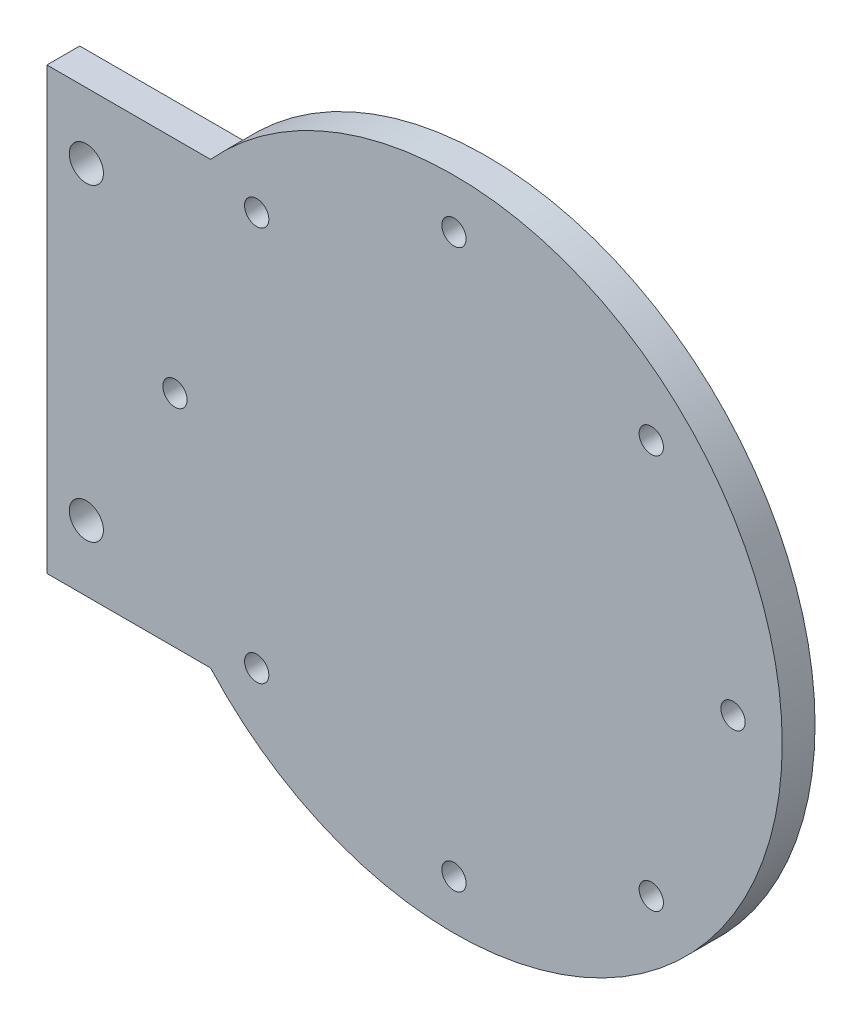
ISO-10303-21;
HEADER;
FILE_DESCRIPTION(('STEP AP214'),'2;1');
FILE_NAME('part.step','',(''),(''),'','','');
FILE_SCHEMA(('AUTOMOTIVE_DESIGN { 1 0 10303 214 1 1 1 1 }'));
ENDSEC;
DATA;
#1=APPLICATION_CONTEXT('core data for automotive mechanical design processes');
#2=APPLICATION_PROTOCOL_DEFINITION('international standard','automotive_design',2000,#1);
#3=PRODUCT_CONTEXT('',#1,'mechanical');
#4=PRODUCT('Part','Part','',(#3));
#5=PRODUCT_RELATED_PRODUCT_CATEGORY('part','',(#4));
#6=PRODUCT_DEFINITION_FORMATION('','',#4);
#7=PRODUCT_DEFINITION_CONTEXT('part definition',#1,'design');
#8=PRODUCT_DEFINITION('design','',#6,#7);
#9=PRODUCT_DEFINITION_SHAPE('','',#8);
#10=(LENGTH_UNIT() NAMED_UNIT(*) SI_UNIT(.MILLI.,.METRE.));
#11=(NAMED_UNIT(*) PLANE_ANGLE_UNIT() SI_UNIT($,.RADIAN.));
#12=(NAMED_UNIT(*) SI_UNIT($,.STERADIAN.) SOLID_ANGLE_UNIT());
#13=UNCERTAINTY_MEASURE_WITH_UNIT(LENGTH_MEASURE(1.E-05),#10,'distance_accuracy_value','');
#14=(GEOMETRIC_REPRESENTATION_CONTEXT(3) GLOBAL_UNCERTAINTY_ASSIGNED_CONTEXT((#13)) GLOBAL_UNIT_ASSIGNED_CONTEXT((#10,
#11,#12)) REPRESENTATION_CONTEXT('',''));
#15=CARTESIAN_POINT('',(0.,0.,0.));
#16=DIRECTION('',(0.,0.,1.));
#17=DIRECTION('',(1.,0.,0.));
#18=AXIS2_PLACEMENT_3D('',#15,#16,#17);
#19=CARTESIAN_POINT('',(0.,0.,-5.));
#20=DIRECTION('',(0.,0.,-1.));
#21=DIRECTION('',(1.,0.,0.));
#22=AXIS2_PLACEMENT_3D('',#19,#20,#21);
#23=PLANE('',#22);
#24=CARTESIAN_POINT('',(-36.3216750602466,-0.267487409630021,-5.));
#25=DIRECTION('',(0.,0.,1.));
#26=DIRECTION('',(1.,0.,0.));
#27=AXIS2_PLACEMENT_3D('',#24,#25,#26);
#28=CIRCLE('',#27,1.85);
#29=CARTESIAN_POINT('',(-34.4716750602466,-0.267487409630021,-5.));
#30=VERTEX_POINT('',#29);
#31=EDGE_CURVE('E130',#30,#30,#28,.T.);
#32=ORIENTED_EDGE('',*,*,#31,.T.);
#33=EDGE_LOOP('',(#32));
#34=FACE_BOUND('',#33,.T.);
#35=CARTESIAN_POINT('',(-23.8737132606749,-30.3195256100583,-5.));
#36=DIRECTION('',(0.,0.,1.));
#37=DIRECTION('',(1.,0.,0.));
#38=AXIS2_PLACEMENT_3D('',#35,#36,#37);
#39=CIRCLE('',#38,1.85);
#40=CARTESIAN_POINT('',(-22.0237132606749,-30.3195256100583,-5.));
#41=VERTEX_POINT('',#40);
#42=EDGE_CURVE('E135',#41,#41,#39,.T.);
#43=ORIENTED_EDGE('',*,*,#42,.T.);
#44=EDGE_LOOP('',(#43));
#45=FACE_BOUND('',#44,.T.);
#46=CARTESIAN_POINT('',(6.17832493975338,-42.76748740963,-5.));
#47=DIRECTION('',(0.,0.,1.));
#48=DIRECTION('',(1.,0.,0.));
#49=AXIS2_PLACEMENT_3D('',#46,#47,#48);
#50=CIRCLE('',#49,1.85);
#51=CARTESIAN_POINT('',(8.02832493975338,-42.76748740963,-5.));
#52=VERTEX_POINT('',#51);
#53=EDGE_CURVE('E138',#52,#52,#50,.T.);
#54=ORIENTED_EDGE('',*,*,#53,.T.);
#55=EDGE_LOOP('',(#54));
#56=FACE_BOUND('',#55,.T.);
#57=CARTESIAN_POINT('',(36.2303631401817,-30.3195256100583,-5.));
#58=DIRECTION('',(0.,0.,1.));
#59=DIRECTION('',(1.,0.,0.));
#60=AXIS2_PLACEMENT_3D('',#57,#58,#59);
#61=CIRCLE('',#60,1.85);
#62=CARTESIAN_POINT('',(38.0803631401817,-30.3195256100583,-5.));
#63=VERTEX_POINT('',#62);
#64=EDGE_CURVE('E141',#63,#63,#61,.T.);
#65=ORIENTED_EDGE('',*,*,#64,.T.);
#66=EDGE_LOOP('',(#65));
#67=FACE_BOUND('',#66,.T.);
#68=CARTESIAN_POINT('',(48.6783249397534,-0.267487409630026,-5.));
#69=DIRECTION('',(0.,0.,1.));
#70=DIRECTION('',(1.,0.,0.));
#71=AXIS2_PLACEMENT_3D('',#68,#69,#70);
#72=CIRCLE('',#71,1.85);
#73=CARTESIAN_POINT('',(50.5283249397534,-0.267487409630026,-5.));
#74=VERTEX_POINT('',#73);
#75=EDGE_CURVE('E144',#74,#74,#72,.T.);
#76=ORIENTED_EDGE('',*,*,#75,.T.);
#77=EDGE_LOOP('',(#76));
#78=FACE_BOUND('',#77,.T.);
#79=CARTESIAN_POINT('',(36.2303631401817,29.7845507907982,-5.));
#80=DIRECTION('',(0.,0.,1.));
#81=DIRECTION('',(1.,0.,0.));
#82=AXIS2_PLACEMENT_3D('',#79,#80,#81);
#83=CIRCLE('',#82,1.85);
#84=CARTESIAN_POINT('',(38.0803631401817,29.7845507907982,-5.));
#85=VERTEX_POINT('',#84);
#86=EDGE_CURVE('E147',#85,#85,#83,.T.);
#87=ORIENTED_EDGE('',*,*,#86,.T.);
#88=EDGE_LOOP('',(#87));
#89=FACE_BOUND('',#88,.T.);
#90=CARTESIAN_POINT('',(6.17832493975339,42.23251259037,-5.));
#91=DIRECTION('',(0.,0.,1.));
#92=DIRECTION('',(1.,0.,0.));
#93=AXIS2_PLACEMENT_3D('',#90,#91,#92);
#94=CIRCLE('',#93,1.85);
#95=CARTESIAN_POINT('',(8.02832493975339,42.23251259037,-5.));
#96=VERTEX_POINT('',#95);
#97=EDGE_CURVE('E150',#96,#96,#94,.T.);
#98=ORIENTED_EDGE('',*,*,#97,.T.);
#99=EDGE_LOOP('',(#98));
#100=FACE_BOUND('',#99,.T.);
#101=CARTESIAN_POINT('',(-23.8737132606749,29.7845507907983,-5.));
#102=DIRECTION('',(0.,0.,1.));
#103=DIRECTION('',(1.,0.,0.));
#104=AXIS2_PLACEMENT_3D('',#101,#102,#103);
#105=CIRCLE('',#104,1.85);
#106=CARTESIAN_POINT('',(-22.0237132606749,29.7845507907983,-5.));
#107=VERTEX_POINT('',#106);
#108=EDGE_CURVE('E153',#107,#107,#105,.T.);
#109=ORIENTED_EDGE('',*,*,#108,.T.);
#110=EDGE_LOOP('',(#109));
#111=FACE_BOUND('',#110,.T.);
#112=CARTESIAN_POINT('',(-49.8216750602466,-23.8085070721269,-5.));
#113=DIRECTION('',(0.,0.,1.));
#114=DIRECTION('',(1.,0.,0.));
#115=AXIS2_PLACEMENT_3D('',#112,#113,#114);
#116=CIRCLE('',#115,2.6);
#117=CARTESIAN_POINT('',(-47.2216750602466,-23.8085070721269,-5.));
#118=VERTEX_POINT('',#117);
#119=EDGE_CURVE('E106',#118,#118,#116,.T.);
#120=ORIENTED_EDGE('',*,*,#119,.T.);
#121=EDGE_LOOP('',(#120));
#122=FACE_BOUND('',#121,.T.);
#123=DIRECTION('',(-1.,0.,0.));
#124=VECTOR('',#123,1.);
#125=CARTESIAN_POINT('',(0.,-33.8085070721269,-5.));
#126=LINE('',#125,#124);
#127=CARTESIAN_POINT('',(-30.9026674957249,-33.8085070721269,-5.));
#128=VERTEX_POINT('',#127);
#129=CARTESIAN_POINT('',(-55.8216750602466,-33.8085070721269,-5.));
#130=VERTEX_POINT('',#129);
#131=EDGE_CURVE('E101',#128,#130,#126,.T.);
#132=ORIENTED_EDGE('',*,*,#131,.T.);
#133=DIRECTION('',(0.,1.,0.));
#134=VECTOR('',#133,1.);
#135=CARTESIAN_POINT('',(-55.8216750602466,0.,-5.));
#136=LINE('',#135,#134);
#137=CARTESIAN_POINT('',(-55.8216750602466,33.2735322528668,-5.));
#138=VERTEX_POINT('',#137);
#139=EDGE_CURVE('E104',#130,#138,#136,.T.);
#140=ORIENTED_EDGE('',*,*,#139,.T.);
#141=DIRECTION('',(-1.,0.,0.));
#142=VECTOR('',#141,1.);
#143=CARTESIAN_POINT('',(0.,33.2735322528668,-5.));
#144=LINE('',#143,#142);
#145=CARTESIAN_POINT('',(-30.9026674957249,33.2735322528668,-5.));
#146=VERTEX_POINT('',#145);
#147=EDGE_CURVE('E92',#146,#138,#144,.T.);
#148=ORIENTED_EDGE('',*,*,#147,.F.);
#149=CARTESIAN_POINT('',(6.17832493975339,-0.267487409630021,-5.));
#150=DIRECTION('',(0.,0.,1.));
#151=DIRECTION('',(1.,0.,0.));
#152=AXIS2_PLACEMENT_3D('',#149,#150,#151);
#153=CIRCLE('',#152,50.);
#154=EDGE_CURVE('E97',#128,#146,#153,.T.);
#155=ORIENTED_EDGE('',*,*,#154,.F.);
#156=EDGE_LOOP('',(#132,#140,#148,#155));
#157=FACE_BOUND('',#156,.T.);
#158=CARTESIAN_POINT('',(-49.8216750602466,23.2735322528668,-5.));
#159=DIRECTION('',(0.,0.,1.));
#160=DIRECTION('',(1.,0.,0.));
#161=AXIS2_PLACEMENT_3D('',#158,#159,#160);
#162=CIRCLE('',#161,2.6);
#163=CARTESIAN_POINT('',(-47.2216750602466,23.2735322528668,-5.));
#164=VERTEX_POINT('',#163);
#165=EDGE_CURVE('E115',#164,#164,#162,.T.);
#166=ORIENTED_EDGE('',*,*,#165,.T.);
#167=EDGE_LOOP('',(#166));
#168=FACE_BOUND('',#167,.T.);
#169=ADVANCED_FACE('F45',(#34,#45,#56,#67,#78,#89,#100,#111,#122,#157,#168),#23,.T.);
#170=CARTESIAN_POINT('',(0.,0.,0.));
#171=DIRECTION('',(0.,0.,-1.));
#172=DIRECTION('',(1.,0.,0.));
#173=AXIS2_PLACEMENT_3D('',#170,#171,#172);
#174=PLANE('',#173);
#175=CARTESIAN_POINT('',(-36.3216750602466,-0.267487409630021,0.));
#176=DIRECTION('',(0.,0.,-1.));
#177=DIRECTION('',(-1.,0.,0.));
#178=AXIS2_PLACEMENT_3D('',#175,#176,#177);
#179=CIRCLE('',#178,1.85);
#180=CARTESIAN_POINT('',(-38.1716750602466,-0.267487409630021,0.));
#181=VERTEX_POINT('',#180);
#182=EDGE_CURVE('E159',#181,#181,#179,.T.);
#183=ORIENTED_EDGE('',*,*,#182,.T.);
#184=EDGE_LOOP('',(#183));
#185=FACE_BOUND('',#184,.T.);
#186=CARTESIAN_POINT('',(-23.8737132606749,-30.3195256100583,0.));
#187=DIRECTION('',(0.,0.,-1.));
#188=DIRECTION('',(-1.,0.,0.));
#189=AXIS2_PLACEMENT_3D('',#186,#187,#188);
#190=CIRCLE('',#189,1.85);
#191=CARTESIAN_POINT('',(-25.7237132606749,-30.3195256100583,0.));
#192=VERTEX_POINT('',#191);
#193=EDGE_CURVE('E167',#192,#192,#190,.T.);
#194=ORIENTED_EDGE('',*,*,#193,.T.);
#195=EDGE_LOOP('',(#194));
#196=FACE_BOUND('',#195,.T.);
#197=CARTESIAN_POINT('',(6.17832493975338,-42.76748740963,0.));
#198=DIRECTION('',(0.,0.,-1.));
#199=DIRECTION('',(-1.,0.,0.));
#200=AXIS2_PLACEMENT_3D('',#197,#198,#199);
#201=CIRCLE('',#200,1.85);
#202=CARTESIAN_POINT('',(4.32832493975338,-42.76748740963,0.));
#203=VERTEX_POINT('',#202);
#204=EDGE_CURVE('E163',#203,#203,#201,.T.);
#205=ORIENTED_EDGE('',*,*,#204,.T.);
#206=EDGE_LOOP('',(#205));
#207=FACE_BOUND('',#206,.T.);
#208=CARTESIAN_POINT('',(36.2303631401817,-30.3195256100583,0.));
#209=DIRECTION('',(0.,0.,-1.));
#210=DIRECTION('',(-1.,0.,0.));
#211=AXIS2_PLACEMENT_3D('',#208,#209,#210);
#212=CIRCLE('',#211,1.85);
#213=CARTESIAN_POINT('',(34.3803631401817,-30.3195256100583,0.));
#214=VERTEX_POINT('',#213);
#215=EDGE_CURVE('E160',#214,#214,#212,.T.);
#216=ORIENTED_EDGE('',*,*,#215,.T.);
#217=EDGE_LOOP('',(#216));
#218=FACE_BOUND('',#217,.T.);
#219=CARTESIAN_POINT('',(48.6783249397534,-0.267487409630026,0.));
#220=DIRECTION('',(0.,0.,-1.));
#221=DIRECTION('',(-1.,0.,0.));
#222=AXIS2_PLACEMENT_3D('',#219,#220,#221);
#223=CIRCLE('',#222,1.85);
#224=CARTESIAN_POINT('',(46.8283249397534,-0.267487409630026,0.));
#225=VERTEX_POINT('',#224);
#226=EDGE_CURVE('E164',#225,#225,#223,.T.);
#227=ORIENTED_EDGE('',*,*,#226,.T.);
#228=EDGE_LOOP('',(#227));
#229=FACE_BOUND('',#228,.T.);
#230=CARTESIAN_POINT('',(36.2303631401817,29.7845507907982,0.));
#231=DIRECTION('',(0.,0.,-1.));
#232=DIRECTION('',(-1.,0.,0.));
#233=AXIS2_PLACEMENT_3D('',#230,#231,#232);
#234=CIRCLE('',#233,1.85);
#235=CARTESIAN_POINT('',(34.3803631401817,29.7845507907982,0.));
#236=VERTEX_POINT('',#235);
#237=EDGE_CURVE('E175',#236,#236,#234,.T.);
#238=ORIENTED_EDGE('',*,*,#237,.T.);
#239=EDGE_LOOP('',(#238));
#240=FACE_BOUND('',#239,.T.);
#241=CARTESIAN_POINT('',(6.17832493975339,42.23251259037,0.));
#242=DIRECTION('',(0.,0.,-1.));
#243=DIRECTION('',(-1.,0.,0.));
#244=AXIS2_PLACEMENT_3D('',#241,#242,#243);
#245=CIRCLE('',#244,1.85);
#246=CARTESIAN_POINT('',(4.32832493975339,42.23251259037,0.));
#247=VERTEX_POINT('',#246);
#248=EDGE_CURVE('E172',#247,#247,#245,.T.);
#249=ORIENTED_EDGE('',*,*,#248,.T.);
#250=EDGE_LOOP('',(#249));
#251=FACE_BOUND('',#250,.T.);
#252=CARTESIAN_POINT('',(-23.8737132606749,29.7845507907983,0.));
#253=DIRECTION('',(0.,0.,-1.));
#254=DIRECTION('',(-1.,0.,0.));
#255=AXIS2_PLACEMENT_3D('',#252,#253,#254);
#256=CIRCLE('',#255,1.85);
#257=CARTESIAN_POINT('',(-25.7237132606749,29.7845507907983,0.));
#258=VERTEX_POINT('',#257);
#259=EDGE_CURVE('E156',#258,#258,#256,.T.);
#260=ORIENTED_EDGE('',*,*,#259,.T.);
#261=EDGE_LOOP('',(#260));
#262=FACE_BOUND('',#261,.T.);
#263=DIRECTION('',(-1.,0.,0.));
#264=VECTOR('',#263,1.);
#265=CARTESIAN_POINT('',(0.,-33.8085070721269,0.));
#266=LINE('',#265,#264);
#267=CARTESIAN_POINT('',(-30.9026674957249,-33.8085070721269,0.));
#268=VERTEX_POINT('',#267);
#269=CARTESIAN_POINT('',(-55.8216750602466,-33.8085070721269,0.));
#270=VERTEX_POINT('',#269);
#271=EDGE_CURVE('E112',#268,#270,#266,.T.);
#272=ORIENTED_EDGE('',*,*,#271,.F.);
#273=CARTESIAN_POINT('',(6.17832493975339,-0.267487409630021,0.));
#274=DIRECTION('',(0.,0.,1.));
#275=DIRECTION('',(1.,0.,0.));
#276=AXIS2_PLACEMENT_3D('',#273,#274,#275);
#277=CIRCLE('',#276,50.);
#278=CARTESIAN_POINT('',(-30.9026674957249,33.2735322528668,0.));
#279=VERTEX_POINT('',#278);
#280=EDGE_CURVE('E114',#268,#279,#277,.T.);
#281=ORIENTED_EDGE('',*,*,#280,.T.);
#282=DIRECTION('',(-1.,0.,0.));
#283=VECTOR('',#282,1.);
#284=CARTESIAN_POINT('',(0.,33.2735322528668,0.));
#285=LINE('',#284,#283);
#286=CARTESIAN_POINT('',(-55.8216750602466,33.2735322528668,0.));
#287=VERTEX_POINT('',#286);
#288=EDGE_CURVE('E95',#279,#287,#285,.T.);
#289=ORIENTED_EDGE('',*,*,#288,.T.);
#290=DIRECTION('',(0.,1.,0.));
#291=VECTOR('',#290,1.);
#292=CARTESIAN_POINT('',(-55.8216750602466,0.,0.));
#293=LINE('',#292,#291);
#294=EDGE_CURVE('E118',#270,#287,#293,.T.);
#295=ORIENTED_EDGE('',*,*,#294,.F.);
#296=EDGE_LOOP('',(#272,#281,#289,#295));
#297=FACE_BOUND('',#296,.T.);
#298=CARTESIAN_POINT('',(-49.8216750602466,-23.8085070721269,0.));
#299=DIRECTION('',(0.,0.,1.));
#300=DIRECTION('',(1.,0.,0.));
#301=AXIS2_PLACEMENT_3D('',#298,#299,#300);
#302=CIRCLE('',#301,2.6);
#303=CARTESIAN_POINT('',(-47.2216750602466,-23.8085070721269,0.));
#304=VERTEX_POINT('',#303);
#305=EDGE_CURVE('E120',#304,#304,#302,.T.);
#306=ORIENTED_EDGE('',*,*,#305,.F.);
#307=EDGE_LOOP('',(#306));
#308=FACE_BOUND('',#307,.T.);
#309=CARTESIAN_POINT('',(-49.8216750602466,23.2735322528668,0.));
#310=DIRECTION('',(0.,0.,1.));
#311=DIRECTION('',(1.,0.,0.));
#312=AXIS2_PLACEMENT_3D('',#309,#310,#311);
#313=CIRCLE('',#312,2.6);
#314=CARTESIAN_POINT('',(-47.2216750602466,23.2735322528668,0.));
#315=VERTEX_POINT('',#314);
#316=EDGE_CURVE('E127',#315,#315,#313,.T.);
#317=ORIENTED_EDGE('',*,*,#316,.F.);
#318=EDGE_LOOP('',(#317));
#319=FACE_BOUND('',#318,.T.);
#320=ADVANCED_FACE('F181',(#185,#196,#207,#218,#229,#240,#251,#262,#297,#308,#319),#174,.F.);
#321=CARTESIAN_POINT('',(0.,-33.8085070721269,-5.));
#322=DIRECTION('',(0.,-1.,0.));
#323=DIRECTION('',(0.,0.,1.));
#324=AXIS2_PLACEMENT_3D('',#321,#322,#323);
#325=PLANE('',#324);
#326=ORIENTED_EDGE('',*,*,#271,.T.);
#327=DIRECTION('',(0.,0.,1.));
#328=VECTOR('',#327,1.);
#329=CARTESIAN_POINT('',(-55.8216750602466,-33.8085070721269,-5.));
#330=LINE('',#329,#328);
#331=EDGE_CURVE('E62',#130,#270,#330,.T.);
#332=ORIENTED_EDGE('',*,*,#331,.F.);
#333=ORIENTED_EDGE('',*,*,#131,.F.);
#334=DIRECTION('',(0.,0.,1.));
#335=VECTOR('',#334,1.);
#336=CARTESIAN_POINT('',(-30.9026674957249,-33.8085070721269,-5.));
#337=LINE('',#336,#335);
#338=EDGE_CURVE('E11',#128,#268,#337,.T.);
#339=ORIENTED_EDGE('',*,*,#338,.T.);
#340=EDGE_LOOP('',(#326,#332,#333,#339));
#341=FACE_BOUND('',#340,.T.);
#342=ADVANCED_FACE('F47',(#341),#325,.T.);
#343=CARTESIAN_POINT('',(6.17832493975339,-0.267487409630021,-5.));
#344=DIRECTION('',(0.,0.,1.));
#345=DIRECTION('',(-1.,0.,0.));
#346=AXIS2_PLACEMENT_3D('',#343,#344,#345);
#347=CYLINDRICAL_SURFACE('',#346,50.);
#348=ORIENTED_EDGE('',*,*,#280,.F.);
#349=ORIENTED_EDGE('',*,*,#338,.F.);
#350=ORIENTED_EDGE('',*,*,#154,.T.);
#351=DIRECTION('',(0.,0.,1.));
#352=VECTOR('',#351,1.);
#353=CARTESIAN_POINT('',(-30.9026674957249,33.2735322528668,-5.));
#354=LINE('',#353,#352);
#355=EDGE_CURVE('E54',#146,#279,#354,.T.);
#356=ORIENTED_EDGE('',*,*,#355,.T.);
#357=EDGE_LOOP('',(#348,#349,#350,#356));
#358=FACE_BOUND('',#357,.T.);
#359=ADVANCED_FACE('F98',(#358),#347,.T.);
#360=CARTESIAN_POINT('',(0.,33.2735322528668,-5.));
#361=DIRECTION('',(0.,-1.,0.));
#362=DIRECTION('',(0.,0.,1.));
#363=AXIS2_PLACEMENT_3D('',#360,#361,#362);
#364=PLANE('',#363);
#365=ORIENTED_EDGE('',*,*,#288,.F.);
#366=ORIENTED_EDGE('',*,*,#355,.F.);
#367=ORIENTED_EDGE('',*,*,#147,.T.);
#368=DIRECTION('',(0.,0.,1.));
#369=VECTOR('',#368,1.);
#370=CARTESIAN_POINT('',(-55.8216750602466,33.2735322528668,-5.));
#371=LINE('',#370,#369);
#372=EDGE_CURVE('E78',#138,#287,#371,.T.);
#373=ORIENTED_EDGE('',*,*,#372,.T.);
#374=EDGE_LOOP('',(#365,#366,#367,#373));
#375=FACE_BOUND('',#374,.T.);
#376=ADVANCED_FACE('F90',(#375),#364,.F.);
#377=CARTESIAN_POINT('',(-55.8216750602466,0.,-5.));
#378=DIRECTION('',(-1.,0.,0.));
#379=DIRECTION('',(0.,0.,-1.));
#380=AXIS2_PLACEMENT_3D('',#377,#378,#379);
#381=PLANE('',#380);
#382=ORIENTED_EDGE('',*,*,#294,.T.);
#383=ORIENTED_EDGE('',*,*,#372,.F.);
#384=ORIENTED_EDGE('',*,*,#139,.F.);
#385=ORIENTED_EDGE('',*,*,#331,.T.);
#386=EDGE_LOOP('',(#382,#383,#384,#385));
#387=FACE_BOUND('',#386,.T.);
#388=ADVANCED_FACE('F217',(#387),#381,.T.);
#389=CARTESIAN_POINT('',(-49.8216750602466,-23.8085070721269,-5.));
#390=DIRECTION('',(0.,0.,1.));
#391=DIRECTION('',(-1.,0.,0.));
#392=AXIS2_PLACEMENT_3D('',#389,#390,#391);
#393=CYLINDRICAL_SURFACE('',#392,2.6);
#394=ORIENTED_EDGE('',*,*,#119,.F.);
#395=EDGE_LOOP('',(#394));
#396=FACE_BOUND('',#395,.T.);
#397=ORIENTED_EDGE('',*,*,#305,.T.);
#398=EDGE_LOOP('',(#397));
#399=FACE_BOUND('',#398,.T.);
#400=ADVANCED_FACE('F214',(#396,#399),#393,.F.);
#401=CARTESIAN_POINT('',(-49.8216750602466,23.2735322528668,-5.));
#402=DIRECTION('',(0.,0.,1.));
#403=DIRECTION('',(-1.,0.,0.));
#404=AXIS2_PLACEMENT_3D('',#401,#402,#403);
#405=CYLINDRICAL_SURFACE('',#404,2.6);
#406=ORIENTED_EDGE('',*,*,#165,.F.);
#407=EDGE_LOOP('',(#406));
#408=FACE_BOUND('',#407,.T.);
#409=ORIENTED_EDGE('',*,*,#316,.T.);
#410=EDGE_LOOP('',(#409));
#411=FACE_BOUND('',#410,.T.);
#412=ADVANCED_FACE('F211',(#408,#411),#405,.F.);
#413=CARTESIAN_POINT('',(-23.8737132606749,29.7845507907983,-10.));
#414=DIRECTION('',(0.,0.,1.));
#415=DIRECTION('',(-1.,0.,0.));
#416=AXIS2_PLACEMENT_3D('',#413,#414,#415);
#417=CYLINDRICAL_SURFACE('',#416,1.85);
#418=ORIENTED_EDGE('',*,*,#108,.F.);
#419=EDGE_LOOP('',(#418));
#420=FACE_BOUND('',#419,.T.);
#421=ORIENTED_EDGE('',*,*,#259,.F.);
#422=EDGE_LOOP('',(#421));
#423=FACE_BOUND('',#422,.T.);
#424=ADVANCED_FACE('F235',(#420,#423),#417,.F.);
#425=CARTESIAN_POINT('',(6.17832493975339,42.23251259037,-10.));
#426=DIRECTION('',(0.,0.,1.));
#427=DIRECTION('',(-1.,0.,0.));
#428=AXIS2_PLACEMENT_3D('',#425,#426,#427);
#429=CYLINDRICAL_SURFACE('',#428,1.85);
#430=ORIENTED_EDGE('',*,*,#97,.F.);
#431=EDGE_LOOP('',(#430));
#432=FACE_BOUND('',#431,.T.);
#433=ORIENTED_EDGE('',*,*,#248,.F.);
#434=EDGE_LOOP('',(#433));
#435=FACE_BOUND('',#434,.T.);
#436=ADVANCED_FACE('F197',(#432,#435),#429,.F.);
#437=CARTESIAN_POINT('',(36.2303631401817,29.7845507907982,-10.));
#438=DIRECTION('',(0.,0.,1.));
#439=DIRECTION('',(-1.,0.,0.));
#440=AXIS2_PLACEMENT_3D('',#437,#438,#439);
#441=CYLINDRICAL_SURFACE('',#440,1.85);
#442=ORIENTED_EDGE('',*,*,#86,.F.);
#443=EDGE_LOOP('',(#442));
#444=FACE_BOUND('',#443,.T.);
#445=ORIENTED_EDGE('',*,*,#237,.F.);
#446=EDGE_LOOP('',(#445));
#447=FACE_BOUND('',#446,.T.);
#448=ADVANCED_FACE('F187',(#444,#447),#441,.F.);
#449=CARTESIAN_POINT('',(48.6783249397534,-0.267487409630026,-10.));
#450=DIRECTION('',(0.,0.,1.));
#451=DIRECTION('',(-1.,0.,0.));
#452=AXIS2_PLACEMENT_3D('',#449,#450,#451);
#453=CYLINDRICAL_SURFACE('',#452,1.85);
#454=ORIENTED_EDGE('',*,*,#75,.F.);
#455=EDGE_LOOP('',(#454));
#456=FACE_BOUND('',#455,.T.);
#457=ORIENTED_EDGE('',*,*,#226,.F.);
#458=EDGE_LOOP('',(#457));
#459=FACE_BOUND('',#458,.T.);
#460=ADVANCED_FACE('F184',(#456,#459),#453,.F.);
#461=CARTESIAN_POINT('',(36.2303631401817,-30.3195256100583,-10.));
#462=DIRECTION('',(0.,0.,1.));
#463=DIRECTION('',(-1.,0.,0.));
#464=AXIS2_PLACEMENT_3D('',#461,#462,#463);
#465=CYLINDRICAL_SURFACE('',#464,1.85);
#466=ORIENTED_EDGE('',*,*,#64,.F.);
#467=EDGE_LOOP('',(#466));
#468=FACE_BOUND('',#467,.T.);
#469=ORIENTED_EDGE('',*,*,#215,.F.);
#470=EDGE_LOOP('',(#469));
#471=FACE_BOUND('',#470,.T.);
#472=ADVANCED_FACE('F186',(#468,#471),#465,.F.);
#473=CARTESIAN_POINT('',(6.17832493975338,-42.76748740963,-10.));
#474=DIRECTION('',(0.,0.,1.));
#475=DIRECTION('',(-1.,0.,0.));
#476=AXIS2_PLACEMENT_3D('',#473,#474,#475);
#477=CYLINDRICAL_SURFACE('',#476,1.85);
#478=ORIENTED_EDGE('',*,*,#53,.F.);
#479=EDGE_LOOP('',(#478));
#480=FACE_BOUND('',#479,.T.);
#481=ORIENTED_EDGE('',*,*,#204,.F.);
#482=EDGE_LOOP('',(#481));
#483=FACE_BOUND('',#482,.T.);
#484=ADVANCED_FACE('F194',(#480,#483),#477,.F.);
#485=CARTESIAN_POINT('',(-23.8737132606749,-30.3195256100583,-10.));
#486=DIRECTION('',(0.,0.,1.));
#487=DIRECTION('',(-1.,0.,0.));
#488=AXIS2_PLACEMENT_3D('',#485,#486,#487);
#489=CYLINDRICAL_SURFACE('',#488,1.85);
#490=ORIENTED_EDGE('',*,*,#42,.F.);
#491=EDGE_LOOP('',(#490));
#492=FACE_BOUND('',#491,.T.);
#493=ORIENTED_EDGE('',*,*,#193,.F.);
#494=EDGE_LOOP('',(#493));
#495=FACE_BOUND('',#494,.T.);
#496=ADVANCED_FACE('F252',(#492,#495),#489,.F.);
#497=CARTESIAN_POINT('',(-36.3216750602466,-0.267487409630021,-10.));
#498=DIRECTION('',(0.,0.,1.));
#499=DIRECTION('',(-1.,0.,0.));
#500=AXIS2_PLACEMENT_3D('',#497,#498,#499);
#501=CYLINDRICAL_SURFACE('',#500,1.85);
#502=ORIENTED_EDGE('',*,*,#31,.F.);
#503=EDGE_LOOP('',(#502));
#504=FACE_BOUND('',#503,.T.);
#505=ORIENTED_EDGE('',*,*,#182,.F.);
#506=EDGE_LOOP('',(#505));
#507=FACE_BOUND('',#506,.T.);
#508=ADVANCED_FACE('F256',(#504,#507),#501,.F.);
#509=CLOSED_SHELL('',(#169,#320,#342,#359,#376,#388,#400,#412,#424,#436,#448,#460,#472,#484,
#496,#508));
#510=MANIFOLD_SOLID_BREP('B2',#509);
#511=ADVANCED_BREP_SHAPE_REPRESENTATION('',(#18,#510),#14);
#512=SHAPE_DEFINITION_REPRESENTATION(#9,#511);
ENDSEC;
END-ISO-10303-21;
